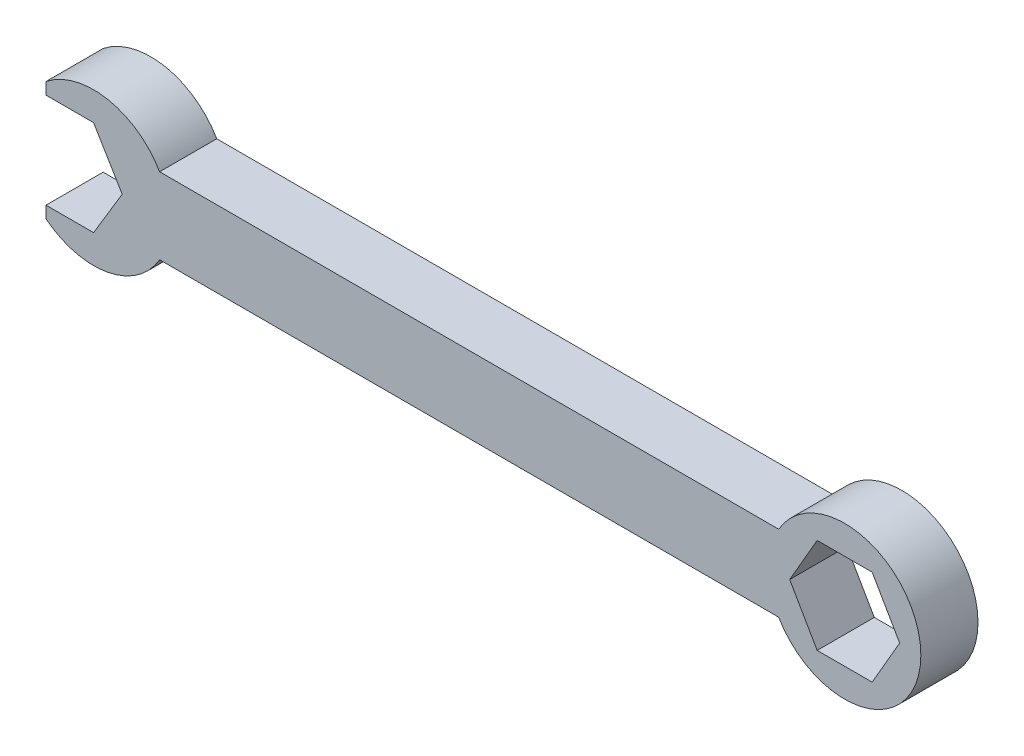
ISO-10303-21;
HEADER;
FILE_DESCRIPTION(('STEP AP214'),'2;1');
FILE_NAME('part.step','',(''),(''),'','','');
FILE_SCHEMA(('AUTOMOTIVE_DESIGN { 1 0 10303 214 1 1 1 1 }'));
ENDSEC;
DATA;
#1=APPLICATION_CONTEXT('core data for automotive mechanical design processes');
#2=APPLICATION_PROTOCOL_DEFINITION('international standard','automotive_design',2000,#1);
#3=PRODUCT_CONTEXT('',#1,'mechanical');
#4=PRODUCT('Part','Part','',(#3));
#5=PRODUCT_RELATED_PRODUCT_CATEGORY('part','',(#4));
#6=PRODUCT_DEFINITION_FORMATION('','',#4);
#7=PRODUCT_DEFINITION_CONTEXT('part definition',#1,'design');
#8=PRODUCT_DEFINITION('design','',#6,#7);
#9=PRODUCT_DEFINITION_SHAPE('','',#8);
#10=(LENGTH_UNIT() NAMED_UNIT(*) SI_UNIT(.MILLI.,.METRE.));
#11=(NAMED_UNIT(*) PLANE_ANGLE_UNIT() SI_UNIT($,.RADIAN.));
#12=(NAMED_UNIT(*) SI_UNIT($,.STERADIAN.) SOLID_ANGLE_UNIT());
#13=UNCERTAINTY_MEASURE_WITH_UNIT(LENGTH_MEASURE(1.E-05),#10,'distance_accuracy_value','');
#14=(GEOMETRIC_REPRESENTATION_CONTEXT(3) GLOBAL_UNCERTAINTY_ASSIGNED_CONTEXT((#13)) GLOBAL_UNIT_ASSIGNED_CONTEXT((#10,
#11,#12)) REPRESENTATION_CONTEXT('',''));
#15=CARTESIAN_POINT('',(0.,0.,0.));
#16=DIRECTION('',(0.,0.,1.));
#17=DIRECTION('',(1.,0.,0.));
#18=AXIS2_PLACEMENT_3D('',#15,#16,#17);
#19=CARTESIAN_POINT('',(-3.81,0.,7.62));
#20=DIRECTION('',(0.,0.,1.));
#21=DIRECTION('',(1.,0.,0.));
#22=AXIS2_PLACEMENT_3D('',#19,#20,#21);
#23=PLANE('',#22);
#24=CARTESIAN_POINT('',(-3.81,0.,7.62));
#25=DIRECTION('',(0.,0.,1.));
#26=DIRECTION('',(1.,0.,0.));
#27=AXIS2_PLACEMENT_3D('',#24,#25,#26);
#28=CIRCLE('',#27,10.16);
#29=CARTESIAN_POINT('',(4.9888181024499,5.08,7.62));
#30=VERTEX_POINT('',#29);
#31=CARTESIAN_POINT('',(-10.16,7.93114745796596,7.62));
#32=VERTEX_POINT('',#31);
#33=EDGE_CURVE('E234',#30,#32,#28,.T.);
#34=ORIENTED_EDGE('',*,*,#33,.T.);
#35=DIRECTION('',(0.,-1.,0.));
#36=VECTOR('',#35,1.);
#37=CARTESIAN_POINT('',(-10.16,6.35,7.62));
#38=LINE('',#37,#36);
#39=CARTESIAN_POINT('',(-10.16,6.35,7.62));
#40=VERTEX_POINT('',#39);
#41=EDGE_CURVE('E238',#32,#40,#38,.T.);
#42=ORIENTED_EDGE('',*,*,#41,.T.);
#43=DIRECTION('',(1.,0.,0.));
#44=VECTOR('',#43,1.);
#45=CARTESIAN_POINT('',(-3.81,6.35,7.62));
#46=LINE('',#45,#44);
#47=CARTESIAN_POINT('',(-3.81,6.35,7.62));
#48=VERTEX_POINT('',#47);
#49=EDGE_CURVE('E242',#40,#48,#46,.T.);
#50=ORIENTED_EDGE('',*,*,#49,.T.);
#51=DIRECTION('',(0.514495755427526,-0.857492925712544,0.));
#52=VECTOR('',#51,1.);
#53=CARTESIAN_POINT('',(0.,0.,7.62));
#54=LINE('',#53,#52);
#55=CARTESIAN_POINT('',(0.,0.,7.62));
#56=VERTEX_POINT('',#55);
#57=EDGE_CURVE('E245',#48,#56,#54,.T.);
#58=ORIENTED_EDGE('',*,*,#57,.T.);
#59=DIRECTION('',(-0.514495755427526,-0.857492925712544,0.));
#60=VECTOR('',#59,1.);
#61=CARTESIAN_POINT('',(0.,0.,7.62));
#62=LINE('',#61,#60);
#63=CARTESIAN_POINT('',(-3.81,-6.35,7.62));
#64=VERTEX_POINT('',#63);
#65=EDGE_CURVE('E248',#56,#64,#62,.T.);
#66=ORIENTED_EDGE('',*,*,#65,.T.);
#67=DIRECTION('',(-1.,0.,0.));
#68=VECTOR('',#67,1.);
#69=CARTESIAN_POINT('',(-3.81,-6.35,7.62));
#70=LINE('',#69,#68);
#71=CARTESIAN_POINT('',(-10.16,-6.35,7.62));
#72=VERTEX_POINT('',#71);
#73=EDGE_CURVE('E251',#64,#72,#70,.T.);
#74=ORIENTED_EDGE('',*,*,#73,.T.);
#75=DIRECTION('',(0.,-1.,0.));
#76=VECTOR('',#75,1.);
#77=CARTESIAN_POINT('',(-10.16,-6.35,7.62));
#78=LINE('',#77,#76);
#79=CARTESIAN_POINT('',(-10.16,-7.93114745796596,7.62));
#80=VERTEX_POINT('',#79);
#81=EDGE_CURVE('E254',#72,#80,#78,.T.);
#82=ORIENTED_EDGE('',*,*,#81,.T.);
#83=CARTESIAN_POINT('',(-3.81,0.,7.62));
#84=DIRECTION('',(0.,0.,1.));
#85=DIRECTION('',(1.,0.,0.));
#86=AXIS2_PLACEMENT_3D('',#83,#84,#85);
#87=CIRCLE('',#86,10.16);
#88=CARTESIAN_POINT('',(4.9888181024499,-5.08,7.62));
#89=VERTEX_POINT('',#88);
#90=EDGE_CURVE('E257',#80,#89,#87,.T.);
#91=ORIENTED_EDGE('',*,*,#90,.T.);
#92=DIRECTION('',(1.,0.,0.));
#93=VECTOR('',#92,1.);
#94=CARTESIAN_POINT('',(4.9888181024499,-5.08,7.62));
#95=LINE('',#94,#93);
#96=CARTESIAN_POINT('',(87.5388181024499,-5.07999999999999,7.62));
#97=VERTEX_POINT('',#96);
#98=EDGE_CURVE('E260',#89,#97,#95,.T.);
#99=ORIENTED_EDGE('',*,*,#98,.T.);
#100=CARTESIAN_POINT('',(96.3376362048998,0.,7.62));
#101=DIRECTION('',(0.,0.,1.));
#102=DIRECTION('',(1.,0.,0.));
#103=AXIS2_PLACEMENT_3D('',#100,#101,#102);
#104=CIRCLE('',#103,10.16);
#105=CARTESIAN_POINT('',(87.5388181024499,5.08000000000001,7.62));
#106=VERTEX_POINT('',#105);
#107=EDGE_CURVE('E263',#97,#106,#104,.T.);
#108=ORIENTED_EDGE('',*,*,#107,.T.);
#109=DIRECTION('',(-1.,0.,0.));
#110=VECTOR('',#109,1.);
#111=CARTESIAN_POINT('',(4.9888181024499,5.08,7.62));
#112=LINE('',#111,#110);
#113=EDGE_CURVE('E266',#106,#30,#112,.T.);
#114=ORIENTED_EDGE('',*,*,#113,.T.);
#115=EDGE_LOOP('',(#34,#42,#50,#58,#66,#74,#82,#91,#99,#108,#114));
#116=FACE_BOUND('',#115,.T.);
#117=DIRECTION('',(-1.,0.,0.));
#118=VECTOR('',#117,1.);
#119=CARTESIAN_POINT('',(100.003810414254,6.35000000000001,7.62));
#120=LINE('',#119,#118);
#121=CARTESIAN_POINT('',(100.003810414254,6.35000000000001,7.62));
#122=VERTEX_POINT('',#121);
#123=CARTESIAN_POINT('',(92.6714619955457,6.35000000000001,7.62));
#124=VERTEX_POINT('',#123);
#125=EDGE_CURVE('E174',#122,#124,#120,.T.);
#126=ORIENTED_EDGE('',*,*,#125,.F.);
#127=DIRECTION('',(-0.5,0.866025403784439,0.));
#128=VECTOR('',#127,1.);
#129=CARTESIAN_POINT('',(103.669984623608,0.,7.62));
#130=LINE('',#129,#128);
#131=CARTESIAN_POINT('',(103.669984623608,0.,7.62));
#132=VERTEX_POINT('',#131);
#133=EDGE_CURVE('E165',#132,#122,#130,.T.);
#134=ORIENTED_EDGE('',*,*,#133,.F.);
#135=DIRECTION('',(0.5,0.866025403784438,0.));
#136=VECTOR('',#135,1.);
#137=CARTESIAN_POINT('',(100.003810414254,-6.34999999999999,7.62));
#138=LINE('',#137,#136);
#139=CARTESIAN_POINT('',(100.003810414254,-6.34999999999999,7.62));
#140=VERTEX_POINT('',#139);
#141=EDGE_CURVE('E200',#140,#132,#138,.T.);
#142=ORIENTED_EDGE('',*,*,#141,.F.);
#143=DIRECTION('',(1.,0.,0.));
#144=VECTOR('',#143,1.);
#145=CARTESIAN_POINT('',(92.6714619955457,-6.34999999999999,7.62));
#146=LINE('',#145,#144);
#147=CARTESIAN_POINT('',(92.6714619955457,-6.34999999999999,7.62));
#148=VERTEX_POINT('',#147);
#149=EDGE_CURVE('E197',#148,#140,#146,.T.);
#150=ORIENTED_EDGE('',*,*,#149,.F.);
#151=DIRECTION('',(0.499999999999999,-0.866025403784439,0.));
#152=VECTOR('',#151,1.);
#153=CARTESIAN_POINT('',(89.0052877861916,0.,7.62));
#154=LINE('',#153,#152);
#155=CARTESIAN_POINT('',(89.0052877861916,0.,7.62));
#156=VERTEX_POINT('',#155);
#157=EDGE_CURVE('E192',#156,#148,#154,.T.);
#158=ORIENTED_EDGE('',*,*,#157,.F.);
#159=DIRECTION('',(-0.5,-0.866025403784439,0.));
#160=VECTOR('',#159,1.);
#161=CARTESIAN_POINT('',(92.6714619955457,6.35000000000001,7.62));
#162=LINE('',#161,#160);
#163=EDGE_CURVE('E188',#124,#156,#162,.T.);
#164=ORIENTED_EDGE('',*,*,#163,.F.);
#165=EDGE_LOOP('',(#126,#134,#142,#150,#158,#164));
#166=FACE_BOUND('',#165,.T.);
#167=ADVANCED_FACE('F45',(#116,#166),#23,.T.);
#168=CARTESIAN_POINT('',(-3.81,0.,0.));
#169=DIRECTION('',(0.,0.,1.));
#170=DIRECTION('',(1.,0.,0.));
#171=AXIS2_PLACEMENT_3D('',#168,#169,#170);
#172=PLANE('',#171);
#173=CARTESIAN_POINT('',(-3.81,0.,0.));
#174=DIRECTION('',(0.,0.,1.));
#175=DIRECTION('',(1.,0.,0.));
#176=AXIS2_PLACEMENT_3D('',#173,#174,#175);
#177=CIRCLE('',#176,10.16);
#178=CARTESIAN_POINT('',(4.9888181024499,5.08,0.));
#179=VERTEX_POINT('',#178);
#180=CARTESIAN_POINT('',(-10.16,7.93114745796596,0.));
#181=VERTEX_POINT('',#180);
#182=EDGE_CURVE('E183',#179,#181,#177,.T.);
#183=ORIENTED_EDGE('',*,*,#182,.F.);
#184=DIRECTION('',(-1.,0.,0.));
#185=VECTOR('',#184,1.);
#186=CARTESIAN_POINT('',(4.9888181024499,5.08,0.));
#187=LINE('',#186,#185);
#188=CARTESIAN_POINT('',(87.5388181024499,5.08000000000001,0.));
#189=VERTEX_POINT('',#188);
#190=EDGE_CURVE('E239',#189,#179,#187,.T.);
#191=ORIENTED_EDGE('',*,*,#190,.F.);
#192=CARTESIAN_POINT('',(96.3376362048998,0.,0.));
#193=DIRECTION('',(0.,0.,1.));
#194=DIRECTION('',(1.,0.,0.));
#195=AXIS2_PLACEMENT_3D('',#192,#193,#194);
#196=CIRCLE('',#195,10.16);
#197=CARTESIAN_POINT('',(87.5388181024499,-5.07999999999999,0.));
#198=VERTEX_POINT('',#197);
#199=EDGE_CURVE('E297',#198,#189,#196,.T.);
#200=ORIENTED_EDGE('',*,*,#199,.F.);
#201=DIRECTION('',(1.,0.,0.));
#202=VECTOR('',#201,1.);
#203=CARTESIAN_POINT('',(4.9888181024499,-5.08,0.));
#204=LINE('',#203,#202);
#205=CARTESIAN_POINT('',(4.9888181024499,-5.08,0.));
#206=VERTEX_POINT('',#205);
#207=EDGE_CURVE('E294',#206,#198,#204,.T.);
#208=ORIENTED_EDGE('',*,*,#207,.F.);
#209=CARTESIAN_POINT('',(-3.81,0.,0.));
#210=DIRECTION('',(0.,0.,1.));
#211=DIRECTION('',(1.,0.,0.));
#212=AXIS2_PLACEMENT_3D('',#209,#210,#211);
#213=CIRCLE('',#212,10.16);
#214=CARTESIAN_POINT('',(-10.16,-7.93114745796596,0.));
#215=VERTEX_POINT('',#214);
#216=EDGE_CURVE('E291',#215,#206,#213,.T.);
#217=ORIENTED_EDGE('',*,*,#216,.F.);
#218=DIRECTION('',(0.,-1.,0.));
#219=VECTOR('',#218,1.);
#220=CARTESIAN_POINT('',(-10.16,-6.35,0.));
#221=LINE('',#220,#219);
#222=CARTESIAN_POINT('',(-10.16,-6.35,0.));
#223=VERTEX_POINT('',#222);
#224=EDGE_CURVE('E288',#223,#215,#221,.T.);
#225=ORIENTED_EDGE('',*,*,#224,.F.);
#226=DIRECTION('',(-1.,0.,0.));
#227=VECTOR('',#226,1.);
#228=CARTESIAN_POINT('',(-3.81,-6.35,0.));
#229=LINE('',#228,#227);
#230=CARTESIAN_POINT('',(-3.81,-6.35,0.));
#231=VERTEX_POINT('',#230);
#232=EDGE_CURVE('E285',#231,#223,#229,.T.);
#233=ORIENTED_EDGE('',*,*,#232,.F.);
#234=DIRECTION('',(-0.514495755427526,-0.857492925712544,0.));
#235=VECTOR('',#234,1.);
#236=CARTESIAN_POINT('',(0.,0.,0.));
#237=LINE('',#236,#235);
#238=CARTESIAN_POINT('',(0.,0.,0.));
#239=VERTEX_POINT('',#238);
#240=EDGE_CURVE('E282',#239,#231,#237,.T.);
#241=ORIENTED_EDGE('',*,*,#240,.F.);
#242=DIRECTION('',(0.514495755427526,-0.857492925712544,0.));
#243=VECTOR('',#242,1.);
#244=CARTESIAN_POINT('',(0.,0.,0.));
#245=LINE('',#244,#243);
#246=CARTESIAN_POINT('',(-3.81,6.35,0.));
#247=VERTEX_POINT('',#246);
#248=EDGE_CURVE('E279',#247,#239,#245,.T.);
#249=ORIENTED_EDGE('',*,*,#248,.F.);
#250=DIRECTION('',(1.,0.,0.));
#251=VECTOR('',#250,1.);
#252=CARTESIAN_POINT('',(-3.81,6.35,0.));
#253=LINE('',#252,#251);
#254=CARTESIAN_POINT('',(-10.16,6.35,0.));
#255=VERTEX_POINT('',#254);
#256=EDGE_CURVE('E276',#255,#247,#253,.T.);
#257=ORIENTED_EDGE('',*,*,#256,.F.);
#258=DIRECTION('',(0.,-1.,0.));
#259=VECTOR('',#258,1.);
#260=CARTESIAN_POINT('',(-10.16,6.35,0.));
#261=LINE('',#260,#259);
#262=EDGE_CURVE('E273',#181,#255,#261,.T.);
#263=ORIENTED_EDGE('',*,*,#262,.F.);
#264=EDGE_LOOP('',(#183,#191,#200,#208,#217,#225,#233,#241,#249,#257,#263));
#265=FACE_BOUND('',#264,.T.);
#266=DIRECTION('',(-0.5,0.866025403784439,0.));
#267=VECTOR('',#266,1.);
#268=CARTESIAN_POINT('',(103.669984623608,0.,0.));
#269=LINE('',#268,#267);
#270=CARTESIAN_POINT('',(103.669984623608,0.,0.));
#271=VERTEX_POINT('',#270);
#272=CARTESIAN_POINT('',(100.003810414254,6.35000000000001,0.));
#273=VERTEX_POINT('',#272);
#274=EDGE_CURVE('E69',#271,#273,#269,.T.);
#275=ORIENTED_EDGE('',*,*,#274,.T.);
#276=DIRECTION('',(-1.,0.,0.));
#277=VECTOR('',#276,1.);
#278=CARTESIAN_POINT('',(100.003810414254,6.35000000000001,0.));
#279=LINE('',#278,#277);
#280=CARTESIAN_POINT('',(92.6714619955457,6.35000000000001,0.));
#281=VERTEX_POINT('',#280);
#282=EDGE_CURVE('E181',#273,#281,#279,.T.);
#283=ORIENTED_EDGE('',*,*,#282,.T.);
#284=DIRECTION('',(-0.5,-0.866025403784439,0.));
#285=VECTOR('',#284,1.);
#286=CARTESIAN_POINT('',(92.6714619955457,6.35000000000001,0.));
#287=LINE('',#286,#285);
#288=CARTESIAN_POINT('',(89.0052877861916,0.,0.));
#289=VERTEX_POINT('',#288);
#290=EDGE_CURVE('E207',#281,#289,#287,.T.);
#291=ORIENTED_EDGE('',*,*,#290,.T.);
#292=DIRECTION('',(0.499999999999999,-0.866025403784439,0.));
#293=VECTOR('',#292,1.);
#294=CARTESIAN_POINT('',(89.0052877861916,0.,0.));
#295=LINE('',#294,#293);
#296=CARTESIAN_POINT('',(92.6714619955457,-6.34999999999999,0.));
#297=VERTEX_POINT('',#296);
#298=EDGE_CURVE('E211',#289,#297,#295,.T.);
#299=ORIENTED_EDGE('',*,*,#298,.T.);
#300=DIRECTION('',(1.,0.,0.));
#301=VECTOR('',#300,1.);
#302=CARTESIAN_POINT('',(92.6714619955457,-6.34999999999999,0.));
#303=LINE('',#302,#301);
#304=CARTESIAN_POINT('',(100.003810414254,-6.34999999999999,0.));
#305=VERTEX_POINT('',#304);
#306=EDGE_CURVE('E215',#297,#305,#303,.T.);
#307=ORIENTED_EDGE('',*,*,#306,.T.);
#308=DIRECTION('',(0.5,0.866025403784438,0.));
#309=VECTOR('',#308,1.);
#310=CARTESIAN_POINT('',(100.003810414254,-6.34999999999999,0.));
#311=LINE('',#310,#309);
#312=EDGE_CURVE('E175',#305,#271,#311,.T.);
#313=ORIENTED_EDGE('',*,*,#312,.T.);
#314=EDGE_LOOP('',(#275,#283,#291,#299,#307,#313));
#315=FACE_BOUND('',#314,.T.);
#316=ADVANCED_FACE('F348',(#265,#315),#172,.F.);
#317=CARTESIAN_POINT('',(-3.81,0.,7.62));
#318=DIRECTION('',(0.,0.,-1.));
#319=DIRECTION('',(-1.,0.,0.));
#320=AXIS2_PLACEMENT_3D('',#317,#318,#319);
#321=CYLINDRICAL_SURFACE('',#320,10.16);
#322=ORIENTED_EDGE('',*,*,#182,.T.);
#323=DIRECTION('',(0.,0.,-1.));
#324=VECTOR('',#323,1.);
#325=CARTESIAN_POINT('',(-10.16,7.93114745796596,7.62));
#326=LINE('',#325,#324);
#327=EDGE_CURVE('E11',#32,#181,#326,.T.);
#328=ORIENTED_EDGE('',*,*,#327,.F.);
#329=ORIENTED_EDGE('',*,*,#33,.F.);
#330=DIRECTION('',(0.,0.,-1.));
#331=VECTOR('',#330,1.);
#332=CARTESIAN_POINT('',(4.9888181024499,5.08,7.62));
#333=LINE('',#332,#331);
#334=EDGE_CURVE('E269',#30,#179,#333,.T.);
#335=ORIENTED_EDGE('',*,*,#334,.T.);
#336=EDGE_LOOP('',(#322,#328,#329,#335));
#337=FACE_BOUND('',#336,.T.);
#338=ADVANCED_FACE('F47',(#337),#321,.T.);
#339=CARTESIAN_POINT('',(-10.16,6.35,7.62));
#340=DIRECTION('',(1.,0.,0.));
#341=DIRECTION('',(0.,0.,-1.));
#342=AXIS2_PLACEMENT_3D('',#339,#340,#341);
#343=PLANE('',#342);
#344=ORIENTED_EDGE('',*,*,#262,.T.);
#345=DIRECTION('',(0.,0.,-1.));
#346=VECTOR('',#345,1.);
#347=CARTESIAN_POINT('',(-10.16,6.35,7.62));
#348=LINE('',#347,#346);
#349=EDGE_CURVE('E54',#40,#255,#348,.T.);
#350=ORIENTED_EDGE('',*,*,#349,.F.);
#351=ORIENTED_EDGE('',*,*,#41,.F.);
#352=ORIENTED_EDGE('',*,*,#327,.T.);
#353=EDGE_LOOP('',(#344,#350,#351,#352));
#354=FACE_BOUND('',#353,.T.);
#355=ADVANCED_FACE('F365',(#354),#343,.F.);
#356=CARTESIAN_POINT('',(-3.81,6.35,7.62));
#357=DIRECTION('',(0.,1.,0.));
#358=DIRECTION('',(-1.,0.,0.));
#359=AXIS2_PLACEMENT_3D('',#356,#357,#358);
#360=PLANE('',#359);
#361=ORIENTED_EDGE('',*,*,#256,.T.);
#362=DIRECTION('',(0.,0.,-1.));
#363=VECTOR('',#362,1.);
#364=CARTESIAN_POINT('',(-3.81,6.35,7.62));
#365=LINE('',#364,#363);
#366=EDGE_CURVE('E333',#48,#247,#365,.T.);
#367=ORIENTED_EDGE('',*,*,#366,.F.);
#368=ORIENTED_EDGE('',*,*,#49,.F.);
#369=ORIENTED_EDGE('',*,*,#349,.T.);
#370=EDGE_LOOP('',(#361,#367,#368,#369));
#371=FACE_BOUND('',#370,.T.);
#372=ADVANCED_FACE('F342',(#371),#360,.F.);
#373=CARTESIAN_POINT('',(0.,0.,7.62));
#374=DIRECTION('',(0.857492925712544,0.514495755427526,0.));
#375=DIRECTION('',(-0.514495755427526,0.857492925712544,0.));
#376=AXIS2_PLACEMENT_3D('',#373,#374,#375);
#377=PLANE('',#376);
#378=ORIENTED_EDGE('',*,*,#248,.T.);
#379=DIRECTION('',(0.,0.,-1.));
#380=VECTOR('',#379,1.);
#381=CARTESIAN_POINT('',(0.,0.,7.62));
#382=LINE('',#381,#380);
#383=EDGE_CURVE('E329',#56,#239,#382,.T.);
#384=ORIENTED_EDGE('',*,*,#383,.F.);
#385=ORIENTED_EDGE('',*,*,#57,.F.);
#386=ORIENTED_EDGE('',*,*,#366,.T.);
#387=EDGE_LOOP('',(#378,#384,#385,#386));
#388=FACE_BOUND('',#387,.T.);
#389=ADVANCED_FACE('F354',(#388),#377,.F.);
#390=CARTESIAN_POINT('',(0.,0.,7.62));
#391=DIRECTION('',(0.857492925712544,-0.514495755427526,0.));
#392=DIRECTION('',(0.514495755427526,0.857492925712544,0.));
#393=AXIS2_PLACEMENT_3D('',#390,#391,#392);
#394=PLANE('',#393);
#395=ORIENTED_EDGE('',*,*,#240,.T.);
#396=DIRECTION('',(0.,0.,-1.));
#397=VECTOR('',#396,1.);
#398=CARTESIAN_POINT('',(-3.81,-6.35,7.62));
#399=LINE('',#398,#397);
#400=EDGE_CURVE('E325',#64,#231,#399,.T.);
#401=ORIENTED_EDGE('',*,*,#400,.F.);
#402=ORIENTED_EDGE('',*,*,#65,.F.);
#403=ORIENTED_EDGE('',*,*,#383,.T.);
#404=EDGE_LOOP('',(#395,#401,#402,#403));
#405=FACE_BOUND('',#404,.T.);
#406=ADVANCED_FACE('F358',(#405),#394,.F.);
#407=CARTESIAN_POINT('',(-3.81,-6.35,7.62));
#408=DIRECTION('',(0.,-1.,0.));
#409=DIRECTION('',(1.,0.,0.));
#410=AXIS2_PLACEMENT_3D('',#407,#408,#409);
#411=PLANE('',#410);
#412=ORIENTED_EDGE('',*,*,#232,.T.);
#413=DIRECTION('',(0.,0.,-1.));
#414=VECTOR('',#413,1.);
#415=CARTESIAN_POINT('',(-10.16,-6.35,7.62));
#416=LINE('',#415,#414);
#417=EDGE_CURVE('E321',#72,#223,#416,.T.);
#418=ORIENTED_EDGE('',*,*,#417,.F.);
#419=ORIENTED_EDGE('',*,*,#73,.F.);
#420=ORIENTED_EDGE('',*,*,#400,.T.);
#421=EDGE_LOOP('',(#412,#418,#419,#420));
#422=FACE_BOUND('',#421,.T.);
#423=ADVANCED_FACE('F393',(#422),#411,.F.);
#424=CARTESIAN_POINT('',(-10.16,-6.35,7.62));
#425=DIRECTION('',(1.,0.,0.));
#426=DIRECTION('',(0.,0.,-1.));
#427=AXIS2_PLACEMENT_3D('',#424,#425,#426);
#428=PLANE('',#427);
#429=ORIENTED_EDGE('',*,*,#224,.T.);
#430=DIRECTION('',(0.,0.,-1.));
#431=VECTOR('',#430,1.);
#432=CARTESIAN_POINT('',(-10.16,-7.93114745796596,7.62));
#433=LINE('',#432,#431);
#434=EDGE_CURVE('E317',#80,#215,#433,.T.);
#435=ORIENTED_EDGE('',*,*,#434,.F.);
#436=ORIENTED_EDGE('',*,*,#81,.F.);
#437=ORIENTED_EDGE('',*,*,#417,.T.);
#438=EDGE_LOOP('',(#429,#435,#436,#437));
#439=FACE_BOUND('',#438,.T.);
#440=ADVANCED_FACE('F391',(#439),#428,.F.);
#441=CARTESIAN_POINT('',(-3.81,0.,7.62));
#442=DIRECTION('',(0.,0.,-1.));
#443=DIRECTION('',(-1.,0.,0.));
#444=AXIS2_PLACEMENT_3D('',#441,#442,#443);
#445=CYLINDRICAL_SURFACE('',#444,10.16);
#446=ORIENTED_EDGE('',*,*,#216,.T.);
#447=DIRECTION('',(0.,0.,-1.));
#448=VECTOR('',#447,1.);
#449=CARTESIAN_POINT('',(4.9888181024499,-5.08,7.62));
#450=LINE('',#449,#448);
#451=EDGE_CURVE('E313',#89,#206,#450,.T.);
#452=ORIENTED_EDGE('',*,*,#451,.F.);
#453=ORIENTED_EDGE('',*,*,#90,.F.);
#454=ORIENTED_EDGE('',*,*,#434,.T.);
#455=EDGE_LOOP('',(#446,#452,#453,#454));
#456=FACE_BOUND('',#455,.T.);
#457=ADVANCED_FACE('F386',(#456),#445,.T.);
#458=CARTESIAN_POINT('',(4.9888181024499,-5.08,7.62));
#459=DIRECTION('',(0.,1.,0.));
#460=DIRECTION('',(-1.,0.,0.));
#461=AXIS2_PLACEMENT_3D('',#458,#459,#460);
#462=PLANE('',#461);
#463=ORIENTED_EDGE('',*,*,#207,.T.);
#464=DIRECTION('',(0.,0.,-1.));
#465=VECTOR('',#464,1.);
#466=CARTESIAN_POINT('',(87.5388181024499,-5.07999999999999,7.62));
#467=LINE('',#466,#465);
#468=EDGE_CURVE('E309',#97,#198,#467,.T.);
#469=ORIENTED_EDGE('',*,*,#468,.F.);
#470=ORIENTED_EDGE('',*,*,#98,.F.);
#471=ORIENTED_EDGE('',*,*,#451,.T.);
#472=EDGE_LOOP('',(#463,#469,#470,#471));
#473=FACE_BOUND('',#472,.T.);
#474=ADVANCED_FACE('F381',(#473),#462,.F.);
#475=CARTESIAN_POINT('',(96.3376362048998,0.,7.62));
#476=DIRECTION('',(0.,0.,-1.));
#477=DIRECTION('',(-1.,0.,0.));
#478=AXIS2_PLACEMENT_3D('',#475,#476,#477);
#479=CYLINDRICAL_SURFACE('',#478,10.16);
#480=ORIENTED_EDGE('',*,*,#199,.T.);
#481=DIRECTION('',(0.,0.,-1.));
#482=VECTOR('',#481,1.);
#483=CARTESIAN_POINT('',(87.5388181024499,5.08000000000001,7.62));
#484=LINE('',#483,#482);
#485=EDGE_CURVE('E305',#106,#189,#484,.T.);
#486=ORIENTED_EDGE('',*,*,#485,.F.);
#487=ORIENTED_EDGE('',*,*,#107,.F.);
#488=ORIENTED_EDGE('',*,*,#468,.T.);
#489=EDGE_LOOP('',(#480,#486,#487,#488));
#490=FACE_BOUND('',#489,.T.);
#491=ADVANCED_FACE('F377',(#490),#479,.T.);
#492=CARTESIAN_POINT('',(4.9888181024499,5.08,7.62));
#493=DIRECTION('',(0.,-1.,0.));
#494=DIRECTION('',(1.,0.,0.));
#495=AXIS2_PLACEMENT_3D('',#492,#493,#494);
#496=PLANE('',#495);
#497=ORIENTED_EDGE('',*,*,#190,.T.);
#498=ORIENTED_EDGE('',*,*,#334,.F.);
#499=ORIENTED_EDGE('',*,*,#113,.F.);
#500=ORIENTED_EDGE('',*,*,#485,.T.);
#501=EDGE_LOOP('',(#497,#498,#499,#500));
#502=FACE_BOUND('',#501,.T.);
#503=ADVANCED_FACE('F372',(#502),#496,.F.);
#504=CARTESIAN_POINT('',(103.669984623608,0.,7.62));
#505=DIRECTION('',(-0.866025403784439,-0.5,0.));
#506=DIRECTION('',(0.5,-0.866025403784439,0.));
#507=AXIS2_PLACEMENT_3D('',#504,#505,#506);
#508=PLANE('',#507);
#509=ORIENTED_EDGE('',*,*,#274,.F.);
#510=DIRECTION('',(0.,0.,-1.));
#511=VECTOR('',#510,1.);
#512=CARTESIAN_POINT('',(103.669984623608,0.,7.62));
#513=LINE('',#512,#511);
#514=EDGE_CURVE('E169',#132,#271,#513,.T.);
#515=ORIENTED_EDGE('',*,*,#514,.F.);
#516=ORIENTED_EDGE('',*,*,#133,.T.);
#517=DIRECTION('',(0.,0.,-1.));
#518=VECTOR('',#517,1.);
#519=CARTESIAN_POINT('',(100.003810414254,6.35000000000001,7.62));
#520=LINE('',#519,#518);
#521=EDGE_CURVE('E168',#122,#273,#520,.T.);
#522=ORIENTED_EDGE('',*,*,#521,.T.);
#523=EDGE_LOOP('',(#509,#515,#516,#522));
#524=FACE_BOUND('',#523,.T.);
#525=ADVANCED_FACE('F167',(#524),#508,.T.);
#526=CARTESIAN_POINT('',(100.003810414254,6.35000000000001,7.62));
#527=DIRECTION('',(0.,-1.,0.));
#528=DIRECTION('',(0.,0.,-1.));
#529=AXIS2_PLACEMENT_3D('',#526,#527,#528);
#530=PLANE('',#529);
#531=ORIENTED_EDGE('',*,*,#282,.F.);
#532=ORIENTED_EDGE('',*,*,#521,.F.);
#533=ORIENTED_EDGE('',*,*,#125,.T.);
#534=DIRECTION('',(0.,0.,-1.));
#535=VECTOR('',#534,1.);
#536=CARTESIAN_POINT('',(92.6714619955457,6.35000000000001,7.62));
#537=LINE('',#536,#535);
#538=EDGE_CURVE('E184',#124,#281,#537,.T.);
#539=ORIENTED_EDGE('',*,*,#538,.T.);
#540=EDGE_LOOP('',(#531,#532,#533,#539));
#541=FACE_BOUND('',#540,.T.);
#542=ADVANCED_FACE('F178',(#541),#530,.T.);
#543=CARTESIAN_POINT('',(92.6714619955457,6.35000000000001,7.62));
#544=DIRECTION('',(0.866025403784439,-0.5,0.));
#545=DIRECTION('',(0.5,0.866025403784439,0.));
#546=AXIS2_PLACEMENT_3D('',#543,#544,#545);
#547=PLANE('',#546);
#548=ORIENTED_EDGE('',*,*,#290,.F.);
#549=ORIENTED_EDGE('',*,*,#538,.F.);
#550=ORIENTED_EDGE('',*,*,#163,.T.);
#551=DIRECTION('',(0.,0.,-1.));
#552=VECTOR('',#551,1.);
#553=CARTESIAN_POINT('',(89.0052877861916,0.,7.62));
#554=LINE('',#553,#552);
#555=EDGE_CURVE('E229',#156,#289,#554,.T.);
#556=ORIENTED_EDGE('',*,*,#555,.T.);
#557=EDGE_LOOP('',(#548,#549,#550,#556));
#558=FACE_BOUND('',#557,.T.);
#559=ADVANCED_FACE('F450',(#558),#547,.T.);
#560=CARTESIAN_POINT('',(89.0052877861916,0.,7.62));
#561=DIRECTION('',(0.866025403784439,0.499999999999999,0.));
#562=DIRECTION('',(-0.499999999999999,0.866025403784439,0.));
#563=AXIS2_PLACEMENT_3D('',#560,#561,#562);
#564=PLANE('',#563);
#565=ORIENTED_EDGE('',*,*,#298,.F.);
#566=ORIENTED_EDGE('',*,*,#555,.F.);
#567=ORIENTED_EDGE('',*,*,#157,.T.);
#568=DIRECTION('',(0.,0.,-1.));
#569=VECTOR('',#568,1.);
#570=CARTESIAN_POINT('',(92.6714619955457,-6.34999999999999,7.62));
#571=LINE('',#570,#569);
#572=EDGE_CURVE('E226',#148,#297,#571,.T.);
#573=ORIENTED_EDGE('',*,*,#572,.T.);
#574=EDGE_LOOP('',(#565,#566,#567,#573));
#575=FACE_BOUND('',#574,.T.);
#576=ADVANCED_FACE('F457',(#575),#564,.T.);
#577=CARTESIAN_POINT('',(92.6714619955457,-6.34999999999999,7.62));
#578=DIRECTION('',(0.,1.,0.));
#579=DIRECTION('',(0.,0.,1.));
#580=AXIS2_PLACEMENT_3D('',#577,#578,#579);
#581=PLANE('',#580);
#582=ORIENTED_EDGE('',*,*,#306,.F.);
#583=ORIENTED_EDGE('',*,*,#572,.F.);
#584=ORIENTED_EDGE('',*,*,#149,.T.);
#585=DIRECTION('',(0.,0.,-1.));
#586=VECTOR('',#585,1.);
#587=CARTESIAN_POINT('',(100.003810414254,-6.34999999999999,7.62));
#588=LINE('',#587,#586);
#589=EDGE_CURVE('E61',#140,#305,#588,.T.);
#590=ORIENTED_EDGE('',*,*,#589,.T.);
#591=EDGE_LOOP('',(#582,#583,#584,#590));
#592=FACE_BOUND('',#591,.T.);
#593=ADVANCED_FACE('F466',(#592),#581,.T.);
#594=CARTESIAN_POINT('',(100.003810414254,-6.34999999999999,7.62));
#595=DIRECTION('',(-0.866025403784438,0.5,0.));
#596=DIRECTION('',(-0.5,-0.866025403784439,0.));
#597=AXIS2_PLACEMENT_3D('',#594,#595,#596);
#598=PLANE('',#597);
#599=ORIENTED_EDGE('',*,*,#312,.F.);
#600=ORIENTED_EDGE('',*,*,#589,.F.);
#601=ORIENTED_EDGE('',*,*,#141,.T.);
#602=ORIENTED_EDGE('',*,*,#514,.T.);
#603=EDGE_LOOP('',(#599,#600,#601,#602));
#604=FACE_BOUND('',#603,.T.);
#605=ADVANCED_FACE('F475',(#604),#598,.T.);
#606=CLOSED_SHELL('',(#167,#316,#338,#355,#372,#389,#406,#423,#440,#457,#474,#491,#503,#525,
#542,#559,#576,#593,#605));
#607=MANIFOLD_SOLID_BREP('B2',#606);
#608=ADVANCED_BREP_SHAPE_REPRESENTATION('',(#18,#607),#14);
#609=SHAPE_DEFINITION_REPRESENTATION(#9,#608);
ENDSEC;
END-ISO-10303-21;
